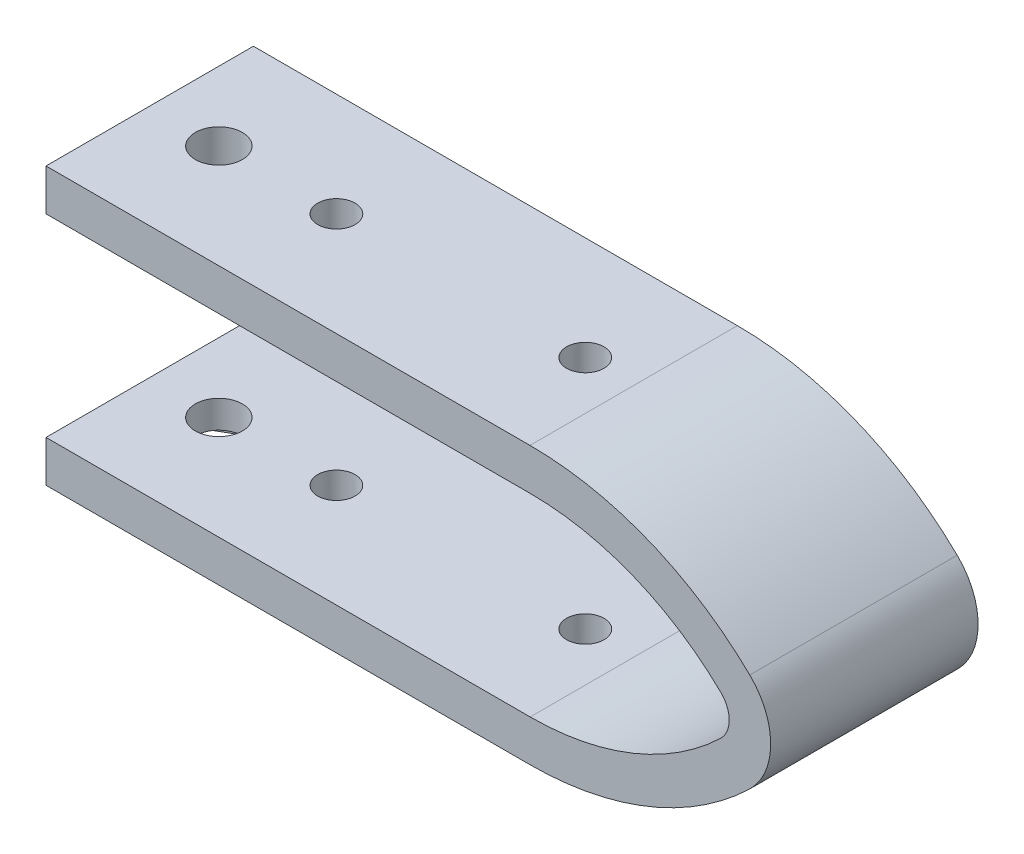
ISO-10303-21;
HEADER;
FILE_DESCRIPTION(('STEP AP214'),'2;1');
FILE_NAME('part.step','',(''),(''),'','','');
FILE_SCHEMA(('AUTOMOTIVE_DESIGN { 1 0 10303 214 1 1 1 1 }'));
ENDSEC;
DATA;
#1=APPLICATION_CONTEXT('core data for automotive mechanical design processes');
#2=APPLICATION_PROTOCOL_DEFINITION('international standard','automotive_design',2000,#1);
#3=PRODUCT_CONTEXT('',#1,'mechanical');
#4=PRODUCT('Part','Part','',(#3));
#5=PRODUCT_RELATED_PRODUCT_CATEGORY('part','',(#4));
#6=PRODUCT_DEFINITION_FORMATION('','',#4);
#7=PRODUCT_DEFINITION_CONTEXT('part definition',#1,'design');
#8=PRODUCT_DEFINITION('design','',#6,#7);
#9=PRODUCT_DEFINITION_SHAPE('','',#8);
#10=(LENGTH_UNIT() NAMED_UNIT(*) SI_UNIT(.MILLI.,.METRE.));
#11=(NAMED_UNIT(*) PLANE_ANGLE_UNIT() SI_UNIT($,.RADIAN.));
#12=(NAMED_UNIT(*) SI_UNIT($,.STERADIAN.) SOLID_ANGLE_UNIT());
#13=UNCERTAINTY_MEASURE_WITH_UNIT(LENGTH_MEASURE(1.E-05),#10,'distance_accuracy_value','');
#14=(GEOMETRIC_REPRESENTATION_CONTEXT(3) GLOBAL_UNCERTAINTY_ASSIGNED_CONTEXT((#13)) GLOBAL_UNIT_ASSIGNED_CONTEXT((#10,
#11,#12)) REPRESENTATION_CONTEXT('',''));
#15=CARTESIAN_POINT('',(0.,0.,0.));
#16=DIRECTION('',(0.,0.,1.));
#17=DIRECTION('',(1.,0.,0.));
#18=AXIS2_PLACEMENT_3D('',#15,#16,#17);
#19=CARTESIAN_POINT('',(5.,0.,7.5));
#20=DIRECTION('',(0.,1.,0.));
#21=DIRECTION('',(0.,0.,1.));
#22=AXIS2_PLACEMENT_3D('',#19,#20,#21);
#23=CYLINDRICAL_SURFACE('',#22,1.7);
#24=CARTESIAN_POINT('',(5.,3.,7.5));
#25=DIRECTION('',(0.,-1.,0.));
#26=DIRECTION('',(0.,0.,-1.));
#27=AXIS2_PLACEMENT_3D('',#24,#25,#26);
#28=CIRCLE('',#27,1.7);
#29=CARTESIAN_POINT('',(5.,3.,5.8));
#30=VERTEX_POINT('',#29);
#31=EDGE_CURVE('E214',#30,#30,#28,.T.);
#32=ORIENTED_EDGE('',*,*,#31,.F.);
#33=EDGE_LOOP('',(#32));
#34=FACE_BOUND('',#33,.T.);
#35=CARTESIAN_POINT('',(5.,1.,7.5));
#36=DIRECTION('',(0.,-1.,0.));
#37=DIRECTION('',(0.,0.,-1.));
#38=AXIS2_PLACEMENT_3D('',#35,#36,#37);
#39=CIRCLE('',#38,1.7);
#40=CARTESIAN_POINT('',(5.,1.,5.8));
#41=VERTEX_POINT('',#40);
#42=EDGE_CURVE('E35',#41,#41,#39,.F.);
#43=ORIENTED_EDGE('',*,*,#42,.F.);
#44=EDGE_LOOP('',(#43));
#45=FACE_BOUND('',#44,.T.);
#46=ADVANCED_FACE('F31',(#34,#45),#23,.F.);
#47=CARTESIAN_POINT('',(0.,0.,15.));
#48=DIRECTION('',(1.,0.,0.));
#49=DIRECTION('',(0.,0.,-1.));
#50=AXIS2_PLACEMENT_3D('',#47,#48,#49);
#51=PLANE('',#50);
#52=DIRECTION('',(0.,-1.,0.));
#53=VECTOR('',#52,1.);
#54=CARTESIAN_POINT('',(0.,0.,0.));
#55=LINE('',#54,#53);
#56=CARTESIAN_POINT('',(0.,3.,0.));
#57=VERTEX_POINT('',#56);
#58=CARTESIAN_POINT('',(0.,0.,0.));
#59=VERTEX_POINT('',#58);
#60=EDGE_CURVE('E166',#57,#59,#55,.T.);
#61=ORIENTED_EDGE('',*,*,#60,.T.);
#62=DIRECTION('',(0.,0.,-1.));
#63=VECTOR('',#62,1.);
#64=CARTESIAN_POINT('',(0.,0.,15.));
#65=LINE('',#64,#63);
#66=CARTESIAN_POINT('',(0.,0.,15.));
#67=VERTEX_POINT('',#66);
#68=EDGE_CURVE('E11',#67,#59,#65,.T.);
#69=ORIENTED_EDGE('',*,*,#68,.F.);
#70=DIRECTION('',(0.,-1.,0.));
#71=VECTOR('',#70,1.);
#72=CARTESIAN_POINT('',(0.,0.,15.));
#73=LINE('',#72,#71);
#74=CARTESIAN_POINT('',(0.,3.,15.));
#75=VERTEX_POINT('',#74);
#76=EDGE_CURVE('E190',#75,#67,#73,.T.);
#77=ORIENTED_EDGE('',*,*,#76,.F.);
#78=DIRECTION('',(0.,0.,-1.));
#79=VECTOR('',#78,1.);
#80=CARTESIAN_POINT('',(0.,3.,15.));
#81=LINE('',#80,#79);
#82=EDGE_CURVE('E162',#75,#57,#81,.T.);
#83=ORIENTED_EDGE('',*,*,#82,.T.);
#84=EDGE_LOOP('',(#61,#69,#77,#83));
#85=FACE_BOUND('',#84,.T.);
#86=ADVANCED_FACE('F33',(#85),#51,.F.);
#87=CARTESIAN_POINT('',(0.,0.,15.));
#88=DIRECTION('',(0.,1.,0.));
#89=DIRECTION('',(0.,0.,1.));
#90=AXIS2_PLACEMENT_3D('',#87,#88,#89);
#91=PLANE('',#90);
#92=DIRECTION('',(-0.866025403784439,0.,-0.5));
#93=VECTOR('',#92,1.);
#94=CARTESIAN_POINT('',(5.,0.,10.8486315612998));
#95=LINE('',#94,#93);
#96=CARTESIAN_POINT('',(5.,0.,10.8486315612998));
#97=VERTEX_POINT('',#96);
#98=CARTESIAN_POINT('',(2.1,0.,9.17431578064991));
#99=VERTEX_POINT('',#98);
#100=EDGE_CURVE('E564',#97,#99,#95,.T.);
#101=ORIENTED_EDGE('',*,*,#100,.F.);
#102=DIRECTION('',(-0.866025403784439,0.,0.499999999999999));
#103=VECTOR('',#102,1.);
#104=CARTESIAN_POINT('',(7.9,0.,9.17431578064992));
#105=LINE('',#104,#103);
#106=CARTESIAN_POINT('',(7.9,0.,9.17431578064992));
#107=VERTEX_POINT('',#106);
#108=EDGE_CURVE('E48',#107,#97,#105,.T.);
#109=ORIENTED_EDGE('',*,*,#108,.F.);
#110=DIRECTION('',(0.,0.,1.));
#111=VECTOR('',#110,1.);
#112=CARTESIAN_POINT('',(7.9,0.,5.82568421935008));
#113=LINE('',#112,#111);
#114=CARTESIAN_POINT('',(7.9,0.,5.82568421935008));
#115=VERTEX_POINT('',#114);
#116=EDGE_CURVE('E588',#115,#107,#113,.T.);
#117=ORIENTED_EDGE('',*,*,#116,.F.);
#118=DIRECTION('',(0.866025403784438,0.,0.5));
#119=VECTOR('',#118,1.);
#120=CARTESIAN_POINT('',(5.,0.,4.15136843870017));
#121=LINE('',#120,#119);
#122=CARTESIAN_POINT('',(5.,0.,4.15136843870017));
#123=VERTEX_POINT('',#122);
#124=EDGE_CURVE('E582',#123,#115,#121,.T.);
#125=ORIENTED_EDGE('',*,*,#124,.F.);
#126=DIRECTION('',(0.866025403784439,0.,-0.499999999999999));
#127=VECTOR('',#126,1.);
#128=CARTESIAN_POINT('',(2.1,0.,5.82568421935008));
#129=LINE('',#128,#127);
#130=CARTESIAN_POINT('',(2.1,0.,5.82568421935008));
#131=VERTEX_POINT('',#130);
#132=EDGE_CURVE('E579',#131,#123,#129,.T.);
#133=ORIENTED_EDGE('',*,*,#132,.F.);
#134=DIRECTION('',(0.,0.,-1.));
#135=VECTOR('',#134,1.);
#136=CARTESIAN_POINT('',(2.1,0.,9.17431578064991));
#137=LINE('',#136,#135);
#138=EDGE_CURVE('E573',#99,#131,#137,.T.);
#139=ORIENTED_EDGE('',*,*,#138,.F.);
#140=EDGE_LOOP('',(#101,#109,#117,#125,#133,#139));
#141=FACE_BOUND('',#140,.T.);
#142=CARTESIAN_POINT('',(31.5,0.,7.5));
#143=DIRECTION('',(0.,1.,0.));
#144=DIRECTION('',(0.,0.,1.));
#145=AXIS2_PLACEMENT_3D('',#142,#143,#144);
#146=CIRCLE('',#145,1.35);
#147=CARTESIAN_POINT('',(31.5,0.,8.85));
#148=VERTEX_POINT('',#147);
#149=EDGE_CURVE('E225',#148,#148,#146,.T.);
#150=ORIENTED_EDGE('',*,*,#149,.T.);
#151=EDGE_LOOP('',(#150));
#152=FACE_BOUND('',#151,.T.);
#153=CARTESIAN_POINT('',(13.5,0.,7.5));
#154=DIRECTION('',(0.,1.,0.));
#155=DIRECTION('',(0.,0.,1.));
#156=AXIS2_PLACEMENT_3D('',#153,#154,#155);
#157=CIRCLE('',#156,1.35);
#158=CARTESIAN_POINT('',(13.5,0.,8.85));
#159=VERTEX_POINT('',#158);
#160=EDGE_CURVE('E221',#159,#159,#157,.T.);
#161=ORIENTED_EDGE('',*,*,#160,.T.);
#162=EDGE_LOOP('',(#161));
#163=FACE_BOUND('',#162,.T.);
#164=DIRECTION('',(1.,0.,0.));
#165=VECTOR('',#164,1.);
#166=CARTESIAN_POINT('',(0.,0.,0.));
#167=LINE('',#166,#165);
#168=CARTESIAN_POINT('',(35.,0.,0.));
#169=VERTEX_POINT('',#168);
#170=EDGE_CURVE('E169',#59,#169,#167,.T.);
#171=ORIENTED_EDGE('',*,*,#170,.T.);
#172=DIRECTION('',(0.,0.,-1.));
#173=VECTOR('',#172,1.);
#174=CARTESIAN_POINT('',(35.,0.,15.));
#175=LINE('',#174,#173);
#176=CARTESIAN_POINT('',(35.,0.,15.));
#177=VERTEX_POINT('',#176);
#178=EDGE_CURVE('E40',#177,#169,#175,.T.);
#179=ORIENTED_EDGE('',*,*,#178,.F.);
#180=DIRECTION('',(1.,0.,0.));
#181=VECTOR('',#180,1.);
#182=CARTESIAN_POINT('',(0.,0.,15.));
#183=LINE('',#182,#181);
#184=EDGE_CURVE('E110',#67,#177,#183,.T.);
#185=ORIENTED_EDGE('',*,*,#184,.F.);
#186=ORIENTED_EDGE('',*,*,#68,.T.);
#187=EDGE_LOOP('',(#171,#179,#185,#186));
#188=FACE_BOUND('',#187,.T.);
#189=ADVANCED_FACE('F284',(#141,#152,#163,#188),#91,.F.);
#190=CARTESIAN_POINT('',(35.,22.8611120698616,15.));
#191=DIRECTION('',(0.,0.,-1.));
#192=DIRECTION('',(-1.,0.,0.));
#193=AXIS2_PLACEMENT_3D('',#190,#191,#192);
#194=CYLINDRICAL_SURFACE('',#193,22.8611120698616);
#195=CARTESIAN_POINT('',(35.,22.8611120698616,0.));
#196=DIRECTION('',(0.,0.,1.));
#197=DIRECTION('',(1.,0.,0.));
#198=AXIS2_PLACEMENT_3D('',#195,#196,#197);
#199=CIRCLE('',#198,22.8611120698616);
#200=CARTESIAN_POINT('',(50.8963063835796,6.43132544829715,0.));
#201=VERTEX_POINT('',#200);
#202=EDGE_CURVE('E172',#169,#201,#199,.T.);
#203=ORIENTED_EDGE('',*,*,#202,.T.);
#204=DIRECTION('',(0.,0.,-1.));
#205=VECTOR('',#204,1.);
#206=CARTESIAN_POINT('',(50.8963063835796,6.43132544829715,15.));
#207=LINE('',#206,#205);
#208=CARTESIAN_POINT('',(50.8963063835796,6.43132544829715,15.));
#209=VERTEX_POINT('',#208);
#210=EDGE_CURVE('E209',#209,#201,#207,.T.);
#211=ORIENTED_EDGE('',*,*,#210,.F.);
#212=CARTESIAN_POINT('',(35.,22.8611120698616,15.));
#213=DIRECTION('',(0.,0.,1.));
#214=DIRECTION('',(1.,0.,0.));
#215=AXIS2_PLACEMENT_3D('',#212,#213,#214);
#216=CIRCLE('',#215,22.8611120698616);
#217=EDGE_CURVE('E254',#177,#209,#216,.T.);
#218=ORIENTED_EDGE('',*,*,#217,.F.);
#219=ORIENTED_EDGE('',*,*,#178,.T.);
#220=EDGE_LOOP('',(#203,#211,#218,#219));
#221=FACE_BOUND('',#220,.T.);
#222=ADVANCED_FACE('F287',(#221),#194,.T.);
#223=CARTESIAN_POINT('',(47.4435077950274,10.,15.));
#224=DIRECTION('',(0.,0.,-1.));
#225=DIRECTION('',(-1.,0.,0.));
#226=AXIS2_PLACEMENT_3D('',#223,#224,#225);
#227=CYLINDRICAL_SURFACE('',#226,4.96560732932838);
#228=CARTESIAN_POINT('',(47.4435077950274,10.,0.));
#229=DIRECTION('',(0.,0.,1.));
#230=DIRECTION('',(1.,0.,0.));
#231=AXIS2_PLACEMENT_3D('',#228,#229,#230);
#232=CIRCLE('',#231,4.96560732932838);
#233=CARTESIAN_POINT('',(50.8963063835796,13.5686745517028,0.));
#234=VERTEX_POINT('',#233);
#235=EDGE_CURVE('E174',#201,#234,#232,.T.);
#236=ORIENTED_EDGE('',*,*,#235,.T.);
#237=DIRECTION('',(0.,0.,-1.));
#238=VECTOR('',#237,1.);
#239=CARTESIAN_POINT('',(50.8963063835796,13.5686745517028,15.));
#240=LINE('',#239,#238);
#241=CARTESIAN_POINT('',(50.8963063835796,13.5686745517028,15.));
#242=VERTEX_POINT('',#241);
#243=EDGE_CURVE('E206',#242,#234,#240,.T.);
#244=ORIENTED_EDGE('',*,*,#243,.F.);
#245=CARTESIAN_POINT('',(47.4435077950274,10.,15.));
#246=DIRECTION('',(0.,0.,1.));
#247=DIRECTION('',(1.,0.,0.));
#248=AXIS2_PLACEMENT_3D('',#245,#246,#247);
#249=CIRCLE('',#248,4.96560732932838);
#250=EDGE_CURVE('E256',#209,#242,#249,.T.);
#251=ORIENTED_EDGE('',*,*,#250,.F.);
#252=ORIENTED_EDGE('',*,*,#210,.T.);
#253=EDGE_LOOP('',(#236,#244,#251,#252));
#254=FACE_BOUND('',#253,.T.);
#255=ADVANCED_FACE('F292',(#254),#227,.T.);
#256=CARTESIAN_POINT('',(35.,-2.86111206986165,15.));
#257=DIRECTION('',(0.,0.,-1.));
#258=DIRECTION('',(-1.,0.,0.));
#259=AXIS2_PLACEMENT_3D('',#256,#257,#258);
#260=CYLINDRICAL_SURFACE('',#259,22.8611120698616);
#261=CARTESIAN_POINT('',(35.,-2.86111206986165,0.));
#262=DIRECTION('',(0.,0.,1.));
#263=DIRECTION('',(-1.,0.,0.));
#264=AXIS2_PLACEMENT_3D('',#261,#262,#263);
#265=CIRCLE('',#264,22.8611120698616);
#266=CARTESIAN_POINT('',(35.,20.,0.));
#267=VERTEX_POINT('',#266);
#268=EDGE_CURVE('E176',#234,#267,#265,.T.);
#269=ORIENTED_EDGE('',*,*,#268,.T.);
#270=DIRECTION('',(0.,0.,-1.));
#271=VECTOR('',#270,1.);
#272=CARTESIAN_POINT('',(35.,20.,15.));
#273=LINE('',#272,#271);
#274=CARTESIAN_POINT('',(35.,20.,15.));
#275=VERTEX_POINT('',#274);
#276=EDGE_CURVE('E203',#275,#267,#273,.T.);
#277=ORIENTED_EDGE('',*,*,#276,.F.);
#278=CARTESIAN_POINT('',(35.,-2.86111206986165,15.));
#279=DIRECTION('',(0.,0.,1.));
#280=DIRECTION('',(-1.,0.,0.));
#281=AXIS2_PLACEMENT_3D('',#278,#279,#280);
#282=CIRCLE('',#281,22.8611120698616);
#283=EDGE_CURVE('E258',#242,#275,#282,.T.);
#284=ORIENTED_EDGE('',*,*,#283,.F.);
#285=ORIENTED_EDGE('',*,*,#243,.T.);
#286=EDGE_LOOP('',(#269,#277,#284,#285));
#287=FACE_BOUND('',#286,.T.);
#288=ADVANCED_FACE('F298',(#287),#260,.T.);
#289=CARTESIAN_POINT('',(0.,20.,15.));
#290=DIRECTION('',(0.,-1.,0.));
#291=DIRECTION('',(0.,0.,-1.));
#292=AXIS2_PLACEMENT_3D('',#289,#290,#291);
#293=PLANE('',#292);
#294=CARTESIAN_POINT('',(31.5,20.,7.5));
#295=DIRECTION('',(0.,1.,0.));
#296=DIRECTION('',(0.,0.,1.));
#297=AXIS2_PLACEMENT_3D('',#294,#295,#296);
#298=CIRCLE('',#297,1.35);
#299=CARTESIAN_POINT('',(31.5,20.,8.85));
#300=VERTEX_POINT('',#299);
#301=EDGE_CURVE('E232',#300,#300,#298,.T.);
#302=ORIENTED_EDGE('',*,*,#301,.F.);
#303=EDGE_LOOP('',(#302));
#304=FACE_BOUND('',#303,.T.);
#305=CARTESIAN_POINT('',(13.5,20.,7.5));
#306=DIRECTION('',(0.,1.,0.));
#307=DIRECTION('',(0.,0.,1.));
#308=AXIS2_PLACEMENT_3D('',#305,#306,#307);
#309=CIRCLE('',#308,1.35);
#310=CARTESIAN_POINT('',(13.5,20.,8.85));
#311=VERTEX_POINT('',#310);
#312=EDGE_CURVE('E229',#311,#311,#309,.T.);
#313=ORIENTED_EDGE('',*,*,#312,.F.);
#314=EDGE_LOOP('',(#313));
#315=FACE_BOUND('',#314,.T.);
#316=CARTESIAN_POINT('',(5.,20.,7.5));
#317=DIRECTION('',(0.,1.,0.));
#318=DIRECTION('',(0.,0.,1.));
#319=AXIS2_PLACEMENT_3D('',#316,#317,#318);
#320=CIRCLE('',#319,1.7);
#321=CARTESIAN_POINT('',(5.,20.,9.2));
#322=VERTEX_POINT('',#321);
#323=EDGE_CURVE('E217',#322,#322,#320,.T.);
#324=ORIENTED_EDGE('',*,*,#323,.F.);
#325=EDGE_LOOP('',(#324));
#326=FACE_BOUND('',#325,.T.);
#327=DIRECTION('',(-1.,0.,0.));
#328=VECTOR('',#327,1.);
#329=CARTESIAN_POINT('',(0.,20.,0.));
#330=LINE('',#329,#328);
#331=CARTESIAN_POINT('',(0.,20.,0.));
#332=VERTEX_POINT('',#331);
#333=EDGE_CURVE('E178',#267,#332,#330,.T.);
#334=ORIENTED_EDGE('',*,*,#333,.T.);
#335=DIRECTION('',(0.,0.,-1.));
#336=VECTOR('',#335,1.);
#337=CARTESIAN_POINT('',(0.,20.,15.));
#338=LINE('',#337,#336);
#339=CARTESIAN_POINT('',(0.,20.,15.));
#340=VERTEX_POINT('',#339);
#341=EDGE_CURVE('E200',#340,#332,#338,.T.);
#342=ORIENTED_EDGE('',*,*,#341,.F.);
#343=DIRECTION('',(-1.,0.,0.));
#344=VECTOR('',#343,1.);
#345=CARTESIAN_POINT('',(0.,20.,15.));
#346=LINE('',#345,#344);
#347=EDGE_CURVE('E260',#275,#340,#346,.T.);
#348=ORIENTED_EDGE('',*,*,#347,.F.);
#349=ORIENTED_EDGE('',*,*,#276,.T.);
#350=EDGE_LOOP('',(#334,#342,#348,#349));
#351=FACE_BOUND('',#350,.T.);
#352=ADVANCED_FACE('F302',(#304,#315,#326,#351),#293,.F.);
#353=CARTESIAN_POINT('',(0.,20.,15.));
#354=DIRECTION('',(1.,0.,0.));
#355=DIRECTION('',(0.,0.,-1.));
#356=AXIS2_PLACEMENT_3D('',#353,#354,#355);
#357=PLANE('',#356);
#358=DIRECTION('',(0.,-1.,0.));
#359=VECTOR('',#358,1.);
#360=CARTESIAN_POINT('',(0.,20.,0.));
#361=LINE('',#360,#359);
#362=CARTESIAN_POINT('',(0.,17.,0.));
#363=VERTEX_POINT('',#362);
#364=EDGE_CURVE('E180',#332,#363,#361,.T.);
#365=ORIENTED_EDGE('',*,*,#364,.T.);
#366=DIRECTION('',(0.,0.,-1.));
#367=VECTOR('',#366,1.);
#368=CARTESIAN_POINT('',(0.,17.,15.));
#369=LINE('',#368,#367);
#370=CARTESIAN_POINT('',(0.,17.,15.));
#371=VERTEX_POINT('',#370);
#372=EDGE_CURVE('E197',#371,#363,#369,.T.);
#373=ORIENTED_EDGE('',*,*,#372,.F.);
#374=DIRECTION('',(0.,-1.,0.));
#375=VECTOR('',#374,1.);
#376=CARTESIAN_POINT('',(0.,20.,15.));
#377=LINE('',#376,#375);
#378=EDGE_CURVE('E262',#340,#371,#377,.T.);
#379=ORIENTED_EDGE('',*,*,#378,.F.);
#380=ORIENTED_EDGE('',*,*,#341,.T.);
#381=EDGE_LOOP('',(#365,#373,#379,#380));
#382=FACE_BOUND('',#381,.T.);
#383=ADVANCED_FACE('F305',(#382),#357,.F.);
#384=CARTESIAN_POINT('',(0.,17.,15.));
#385=DIRECTION('',(0.,1.,0.));
#386=DIRECTION('',(0.,0.,1.));
#387=AXIS2_PLACEMENT_3D('',#384,#385,#386);
#388=PLANE('',#387);
#389=CARTESIAN_POINT('',(31.5,17.,7.5));
#390=DIRECTION('',(0.,1.,0.));
#391=DIRECTION('',(0.,0.,1.));
#392=AXIS2_PLACEMENT_3D('',#389,#390,#391);
#393=CIRCLE('',#392,1.35);
#394=CARTESIAN_POINT('',(31.5,17.,8.85));
#395=VERTEX_POINT('',#394);
#396=EDGE_CURVE('E224',#395,#395,#393,.T.);
#397=ORIENTED_EDGE('',*,*,#396,.T.);
#398=EDGE_LOOP('',(#397));
#399=FACE_BOUND('',#398,.T.);
#400=CARTESIAN_POINT('',(13.5,17.,7.5));
#401=DIRECTION('',(0.,1.,0.));
#402=DIRECTION('',(0.,0.,1.));
#403=AXIS2_PLACEMENT_3D('',#400,#401,#402);
#404=CIRCLE('',#403,1.35);
#405=CARTESIAN_POINT('',(13.5,17.,8.85));
#406=VERTEX_POINT('',#405);
#407=EDGE_CURVE('E220',#406,#406,#404,.T.);
#408=ORIENTED_EDGE('',*,*,#407,.T.);
#409=EDGE_LOOP('',(#408));
#410=FACE_BOUND('',#409,.T.);
#411=CARTESIAN_POINT('',(5.,17.,7.5));
#412=DIRECTION('',(0.,1.,0.));
#413=DIRECTION('',(0.,0.,1.));
#414=AXIS2_PLACEMENT_3D('',#411,#412,#413);
#415=CIRCLE('',#414,1.7);
#416=CARTESIAN_POINT('',(5.,17.,9.2));
#417=VERTEX_POINT('',#416);
#418=EDGE_CURVE('E170',#417,#417,#415,.T.);
#419=ORIENTED_EDGE('',*,*,#418,.T.);
#420=EDGE_LOOP('',(#419));
#421=FACE_BOUND('',#420,.T.);
#422=DIRECTION('',(1.,0.,0.));
#423=VECTOR('',#422,1.);
#424=CARTESIAN_POINT('',(0.,17.,0.));
#425=LINE('',#424,#423);
#426=CARTESIAN_POINT('',(35.0151197758567,17.,0.));
#427=VERTEX_POINT('',#426);
#428=EDGE_CURVE('E182',#363,#427,#425,.T.);
#429=ORIENTED_EDGE('',*,*,#428,.T.);
#430=DIRECTION('',(0.,0.,-1.));
#431=VECTOR('',#430,1.);
#432=CARTESIAN_POINT('',(35.0151197758567,17.,15.));
#433=LINE('',#432,#431);
#434=CARTESIAN_POINT('',(35.0151197758567,17.,15.));
#435=VERTEX_POINT('',#434);
#436=EDGE_CURVE('E194',#435,#427,#433,.T.);
#437=ORIENTED_EDGE('',*,*,#436,.F.);
#438=DIRECTION('',(1.,0.,0.));
#439=VECTOR('',#438,1.);
#440=CARTESIAN_POINT('',(0.,17.,15.));
#441=LINE('',#440,#439);
#442=EDGE_CURVE('E264',#371,#435,#441,.T.);
#443=ORIENTED_EDGE('',*,*,#442,.F.);
#444=ORIENTED_EDGE('',*,*,#372,.T.);
#445=EDGE_LOOP('',(#429,#437,#443,#444));
#446=FACE_BOUND('',#445,.T.);
#447=ADVANCED_FACE('F270',(#399,#410,#421,#446),#388,.F.);
#448=CARTESIAN_POINT('',(35.0151197758567,-2.86111206986165,15.));
#449=DIRECTION('',(0.,0.,-1.));
#450=DIRECTION('',(-1.,0.,0.));
#451=AXIS2_PLACEMENT_3D('',#448,#449,#450);
#452=CYLINDRICAL_SURFACE('',#451,19.8611120698617);
#453=CARTESIAN_POINT('',(35.0151197758567,-2.86111206986165,0.));
#454=DIRECTION('',(0.,0.,-1.));
#455=DIRECTION('',(-1.,0.,0.));
#456=AXIS2_PLACEMENT_3D('',#453,#454,#455);
#457=CIRCLE('',#456,19.8611120698617);
#458=CARTESIAN_POINT('',(48.7969341246534,11.4401244468493,0.));
#459=VERTEX_POINT('',#458);
#460=EDGE_CURVE('E184',#427,#459,#457,.T.);
#461=ORIENTED_EDGE('',*,*,#460,.T.);
#462=DIRECTION('',(0.,0.,-1.));
#463=VECTOR('',#462,1.);
#464=CARTESIAN_POINT('',(48.7969341246534,11.4401244468493,15.));
#465=LINE('',#464,#463);
#466=CARTESIAN_POINT('',(48.7969341246534,11.4401244468493,15.));
#467=VERTEX_POINT('',#466);
#468=EDGE_CURVE('E157',#467,#459,#465,.T.);
#469=ORIENTED_EDGE('',*,*,#468,.F.);
#470=CARTESIAN_POINT('',(35.0151197758567,-2.86111206986165,15.));
#471=DIRECTION('',(0.,0.,-1.));
#472=DIRECTION('',(-1.,0.,0.));
#473=AXIS2_PLACEMENT_3D('',#470,#471,#472);
#474=CIRCLE('',#473,19.8611120698617);
#475=EDGE_CURVE('E145',#435,#467,#474,.T.);
#476=ORIENTED_EDGE('',*,*,#475,.F.);
#477=ORIENTED_EDGE('',*,*,#436,.T.);
#478=EDGE_LOOP('',(#461,#469,#476,#477));
#479=FACE_BOUND('',#478,.T.);
#480=ADVANCED_FACE('F274',(#479),#452,.F.);
#481=CARTESIAN_POINT('',(47.4091151243558,10.,15.));
#482=DIRECTION('',(0.,0.,-1.));
#483=DIRECTION('',(-1.,0.,0.));
#484=AXIS2_PLACEMENT_3D('',#481,#482,#483);
#485=CYLINDRICAL_SURFACE('',#484,2.00000000000001);
#486=CARTESIAN_POINT('',(47.4091151243558,10.,0.));
#487=DIRECTION('',(0.,0.,-1.));
#488=DIRECTION('',(-1.,0.,0.));
#489=AXIS2_PLACEMENT_3D('',#486,#487,#488);
#490=CIRCLE('',#489,2.00000000000001);
#491=CARTESIAN_POINT('',(48.7969341246534,8.55987555315067,0.));
#492=VERTEX_POINT('',#491);
#493=EDGE_CURVE('E154',#459,#492,#490,.T.);
#494=ORIENTED_EDGE('',*,*,#493,.T.);
#495=DIRECTION('',(0.,0.,-1.));
#496=VECTOR('',#495,1.);
#497=CARTESIAN_POINT('',(48.7969341246534,8.55987555315067,15.));
#498=LINE('',#497,#496);
#499=CARTESIAN_POINT('',(48.7969341246534,8.55987555315067,15.));
#500=VERTEX_POINT('',#499);
#501=EDGE_CURVE('E151',#500,#492,#498,.T.);
#502=ORIENTED_EDGE('',*,*,#501,.F.);
#503=CARTESIAN_POINT('',(47.4091151243558,10.,15.));
#504=DIRECTION('',(0.,0.,-1.));
#505=DIRECTION('',(-1.,0.,0.));
#506=AXIS2_PLACEMENT_3D('',#503,#504,#505);
#507=CIRCLE('',#506,2.00000000000001);
#508=EDGE_CURVE('E138',#467,#500,#507,.T.);
#509=ORIENTED_EDGE('',*,*,#508,.F.);
#510=ORIENTED_EDGE('',*,*,#468,.T.);
#511=EDGE_LOOP('',(#494,#502,#509,#510));
#512=FACE_BOUND('',#511,.T.);
#513=ADVANCED_FACE('F152',(#512),#485,.F.);
#514=CARTESIAN_POINT('',(35.0151197758567,22.8611120698616,15.));
#515=DIRECTION('',(0.,0.,-1.));
#516=DIRECTION('',(-1.,0.,0.));
#517=AXIS2_PLACEMENT_3D('',#514,#515,#516);
#518=CYLINDRICAL_SURFACE('',#517,19.8611120698617);
#519=CARTESIAN_POINT('',(35.0151197758567,22.8611120698616,0.));
#520=DIRECTION('',(0.,0.,-1.));
#521=DIRECTION('',(1.,0.,0.));
#522=AXIS2_PLACEMENT_3D('',#519,#520,#521);
#523=CIRCLE('',#522,19.8611120698617);
#524=CARTESIAN_POINT('',(35.0151197758567,3.,0.));
#525=VERTEX_POINT('',#524);
#526=EDGE_CURVE('E187',#492,#525,#523,.T.);
#527=ORIENTED_EDGE('',*,*,#526,.T.);
#528=DIRECTION('',(0.,0.,-1.));
#529=VECTOR('',#528,1.);
#530=CARTESIAN_POINT('',(35.0151197758567,3.,15.));
#531=LINE('',#530,#529);
#532=CARTESIAN_POINT('',(35.0151197758567,3.,15.));
#533=VERTEX_POINT('',#532);
#534=EDGE_CURVE('E158',#533,#525,#531,.T.);
#535=ORIENTED_EDGE('',*,*,#534,.F.);
#536=CARTESIAN_POINT('',(35.0151197758567,22.8611120698616,15.));
#537=DIRECTION('',(0.,0.,-1.));
#538=DIRECTION('',(1.,0.,0.));
#539=AXIS2_PLACEMENT_3D('',#536,#537,#538);
#540=CIRCLE('',#539,19.8611120698617);
#541=EDGE_CURVE('E142',#500,#533,#540,.T.);
#542=ORIENTED_EDGE('',*,*,#541,.F.);
#543=ORIENTED_EDGE('',*,*,#501,.T.);
#544=EDGE_LOOP('',(#527,#535,#542,#543));
#545=FACE_BOUND('',#544,.T.);
#546=ADVANCED_FACE('F160',(#545),#518,.F.);
#547=CARTESIAN_POINT('',(0.,3.,15.));
#548=DIRECTION('',(0.,-1.,0.));
#549=DIRECTION('',(0.,0.,-1.));
#550=AXIS2_PLACEMENT_3D('',#547,#548,#549);
#551=PLANE('',#550);
#552=CARTESIAN_POINT('',(31.5,3.,7.5));
#553=DIRECTION('',(0.,-1.,0.));
#554=DIRECTION('',(0.,0.,-1.));
#555=AXIS2_PLACEMENT_3D('',#552,#553,#554);
#556=CIRCLE('',#555,1.35);
#557=CARTESIAN_POINT('',(31.5,3.,6.15));
#558=VERTEX_POINT('',#557);
#559=EDGE_CURVE('E222',#558,#558,#556,.T.);
#560=ORIENTED_EDGE('',*,*,#559,.T.);
#561=EDGE_LOOP('',(#560));
#562=FACE_BOUND('',#561,.T.);
#563=CARTESIAN_POINT('',(13.5,3.,7.5));
#564=DIRECTION('',(0.,-1.,0.));
#565=DIRECTION('',(0.,0.,-1.));
#566=AXIS2_PLACEMENT_3D('',#563,#564,#565);
#567=CIRCLE('',#566,1.35);
#568=CARTESIAN_POINT('',(13.5,3.,6.15));
#569=VERTEX_POINT('',#568);
#570=EDGE_CURVE('E218',#569,#569,#567,.T.);
#571=ORIENTED_EDGE('',*,*,#570,.T.);
#572=EDGE_LOOP('',(#571));
#573=FACE_BOUND('',#572,.T.);
#574=ORIENTED_EDGE('',*,*,#31,.T.);
#575=EDGE_LOOP('',(#574));
#576=FACE_BOUND('',#575,.T.);
#577=DIRECTION('',(-1.,0.,0.));
#578=VECTOR('',#577,1.);
#579=CARTESIAN_POINT('',(0.,3.,0.));
#580=LINE('',#579,#578);
#581=EDGE_CURVE('E102',#525,#57,#580,.T.);
#582=ORIENTED_EDGE('',*,*,#581,.T.);
#583=ORIENTED_EDGE('',*,*,#82,.F.);
#584=DIRECTION('',(-1.,0.,0.));
#585=VECTOR('',#584,1.);
#586=CARTESIAN_POINT('',(0.,3.,15.));
#587=LINE('',#586,#585);
#588=EDGE_CURVE('E57',#533,#75,#587,.T.);
#589=ORIENTED_EDGE('',*,*,#588,.F.);
#590=ORIENTED_EDGE('',*,*,#534,.T.);
#591=EDGE_LOOP('',(#582,#583,#589,#590));
#592=FACE_BOUND('',#591,.T.);
#593=ADVANCED_FACE('F278',(#562,#573,#576,#592),#551,.F.);
#594=CARTESIAN_POINT('',(35.0151197758567,22.8611120698616,15.));
#595=DIRECTION('',(0.,0.,1.));
#596=DIRECTION('',(1.,0.,0.));
#597=AXIS2_PLACEMENT_3D('',#594,#595,#596);
#598=PLANE('',#597);
#599=ORIENTED_EDGE('',*,*,#76,.T.);
#600=ORIENTED_EDGE('',*,*,#184,.T.);
#601=ORIENTED_EDGE('',*,*,#217,.T.);
#602=ORIENTED_EDGE('',*,*,#250,.T.);
#603=ORIENTED_EDGE('',*,*,#283,.T.);
#604=ORIENTED_EDGE('',*,*,#347,.T.);
#605=ORIENTED_EDGE('',*,*,#378,.T.);
#606=ORIENTED_EDGE('',*,*,#442,.T.);
#607=ORIENTED_EDGE('',*,*,#475,.T.);
#608=ORIENTED_EDGE('',*,*,#508,.T.);
#609=ORIENTED_EDGE('',*,*,#541,.T.);
#610=ORIENTED_EDGE('',*,*,#588,.T.);
#611=EDGE_LOOP('',(#599,#600,#601,#602,#603,#604,#605,#606,#607,#608,#609,#610));
#612=FACE_BOUND('',#611,.T.);
#613=ADVANCED_FACE('F140',(#612),#598,.T.);
#614=CARTESIAN_POINT('',(35.0151197758567,22.8611120698616,0.));
#615=DIRECTION('',(0.,0.,1.));
#616=DIRECTION('',(1.,0.,0.));
#617=AXIS2_PLACEMENT_3D('',#614,#615,#616);
#618=PLANE('',#617);
#619=ORIENTED_EDGE('',*,*,#60,.F.);
#620=ORIENTED_EDGE('',*,*,#581,.F.);
#621=ORIENTED_EDGE('',*,*,#526,.F.);
#622=ORIENTED_EDGE('',*,*,#493,.F.);
#623=ORIENTED_EDGE('',*,*,#460,.F.);
#624=ORIENTED_EDGE('',*,*,#428,.F.);
#625=ORIENTED_EDGE('',*,*,#364,.F.);
#626=ORIENTED_EDGE('',*,*,#333,.F.);
#627=ORIENTED_EDGE('',*,*,#268,.F.);
#628=ORIENTED_EDGE('',*,*,#235,.F.);
#629=ORIENTED_EDGE('',*,*,#202,.F.);
#630=ORIENTED_EDGE('',*,*,#170,.F.);
#631=EDGE_LOOP('',(#619,#620,#621,#622,#623,#624,#625,#626,#627,#628,#629,#630));
#632=FACE_BOUND('',#631,.T.);
#633=ADVANCED_FACE('F277',(#632),#618,.F.);
#634=ORIENTED_EDGE('',*,*,#323,.T.);
#635=EDGE_LOOP('',(#634));
#636=FACE_BOUND('',#635,.T.);
#637=ORIENTED_EDGE('',*,*,#418,.F.);
#638=EDGE_LOOP('',(#637));
#639=FACE_BOUND('',#638,.T.);
#640=ADVANCED_FACE('F319',(#636,#639),#23,.F.);
#641=CARTESIAN_POINT('',(13.5,0.,7.5));
#642=DIRECTION('',(0.,1.,0.));
#643=DIRECTION('',(0.,0.,1.));
#644=AXIS2_PLACEMENT_3D('',#641,#642,#643);
#645=CYLINDRICAL_SURFACE('',#644,1.35);
#646=ORIENTED_EDGE('',*,*,#160,.F.);
#647=EDGE_LOOP('',(#646));
#648=FACE_BOUND('',#647,.T.);
#649=ORIENTED_EDGE('',*,*,#570,.F.);
#650=EDGE_LOOP('',(#649));
#651=FACE_BOUND('',#650,.T.);
#652=ADVANCED_FACE('F328',(#648,#651),#645,.F.);
#653=ORIENTED_EDGE('',*,*,#312,.T.);
#654=EDGE_LOOP('',(#653));
#655=FACE_BOUND('',#654,.T.);
#656=ORIENTED_EDGE('',*,*,#407,.F.);
#657=EDGE_LOOP('',(#656));
#658=FACE_BOUND('',#657,.T.);
#659=ADVANCED_FACE('F334',(#655,#658),#645,.F.);
#660=CARTESIAN_POINT('',(31.5,0.,7.5));
#661=DIRECTION('',(0.,1.,0.));
#662=DIRECTION('',(0.,0.,1.));
#663=AXIS2_PLACEMENT_3D('',#660,#661,#662);
#664=CYLINDRICAL_SURFACE('',#663,1.35);
#665=ORIENTED_EDGE('',*,*,#149,.F.);
#666=EDGE_LOOP('',(#665));
#667=FACE_BOUND('',#666,.T.);
#668=ORIENTED_EDGE('',*,*,#559,.F.);
#669=EDGE_LOOP('',(#668));
#670=FACE_BOUND('',#669,.T.);
#671=ADVANCED_FACE('F518',(#667,#670),#664,.F.);
#672=ORIENTED_EDGE('',*,*,#301,.T.);
#673=EDGE_LOOP('',(#672));
#674=FACE_BOUND('',#673,.T.);
#675=ORIENTED_EDGE('',*,*,#396,.F.);
#676=EDGE_LOOP('',(#675));
#677=FACE_BOUND('',#676,.T.);
#678=ADVANCED_FACE('F452',(#674,#677),#664,.F.);
#679=CARTESIAN_POINT('',(5.,1.,10.8486315612998));
#680=DIRECTION('',(0.,-1.,0.));
#681=DIRECTION('',(0.,0.,-1.));
#682=AXIS2_PLACEMENT_3D('',#679,#680,#681);
#683=PLANE('',#682);
#684=DIRECTION('',(-0.866025403784439,0.,0.499999999999999));
#685=VECTOR('',#684,1.);
#686=CARTESIAN_POINT('',(7.9,1.,9.17431578064992));
#687=LINE('',#686,#685);
#688=CARTESIAN_POINT('',(7.9,1.,9.17431578064992));
#689=VERTEX_POINT('',#688);
#690=CARTESIAN_POINT('',(5.,1.,10.8486315612998));
#691=VERTEX_POINT('',#690);
#692=EDGE_CURVE('E591',#689,#691,#687,.T.);
#693=ORIENTED_EDGE('',*,*,#692,.T.);
#694=DIRECTION('',(-0.866025403784439,0.,-0.5));
#695=VECTOR('',#694,1.);
#696=CARTESIAN_POINT('',(5.,1.,10.8486315612998));
#697=LINE('',#696,#695);
#698=CARTESIAN_POINT('',(2.1,1.,9.17431578064991));
#699=VERTEX_POINT('',#698);
#700=EDGE_CURVE('E617',#691,#699,#697,.T.);
#701=ORIENTED_EDGE('',*,*,#700,.T.);
#702=DIRECTION('',(0.,0.,-1.));
#703=VECTOR('',#702,1.);
#704=CARTESIAN_POINT('',(2.1,1.,9.17431578064991));
#705=LINE('',#704,#703);
#706=CARTESIAN_POINT('',(2.1,1.,5.82568421935008));
#707=VERTEX_POINT('',#706);
#708=EDGE_CURVE('E614',#699,#707,#705,.T.);
#709=ORIENTED_EDGE('',*,*,#708,.T.);
#710=DIRECTION('',(0.866025403784439,0.,-0.499999999999999));
#711=VECTOR('',#710,1.);
#712=CARTESIAN_POINT('',(2.1,1.,5.82568421935008));
#713=LINE('',#712,#711);
#714=CARTESIAN_POINT('',(5.,1.,4.15136843870017));
#715=VERTEX_POINT('',#714);
#716=EDGE_CURVE('E609',#707,#715,#713,.T.);
#717=ORIENTED_EDGE('',*,*,#716,.T.);
#718=DIRECTION('',(0.866025403784438,0.,0.5));
#719=VECTOR('',#718,1.);
#720=CARTESIAN_POINT('',(5.,1.,4.15136843870017));
#721=LINE('',#720,#719);
#722=CARTESIAN_POINT('',(7.9,1.,5.82568421935008));
#723=VERTEX_POINT('',#722);
#724=EDGE_CURVE('E604',#715,#723,#721,.T.);
#725=ORIENTED_EDGE('',*,*,#724,.T.);
#726=DIRECTION('',(0.,0.,1.));
#727=VECTOR('',#726,1.);
#728=CARTESIAN_POINT('',(7.9,1.,5.82568421935008));
#729=LINE('',#728,#727);
#730=EDGE_CURVE('E602',#723,#689,#729,.T.);
#731=ORIENTED_EDGE('',*,*,#730,.T.);
#732=EDGE_LOOP('',(#693,#701,#709,#717,#725,#731));
#733=FACE_BOUND('',#732,.T.);
#734=ORIENTED_EDGE('',*,*,#42,.T.);
#735=EDGE_LOOP('',(#734));
#736=FACE_BOUND('',#735,.T.);
#737=ADVANCED_FACE('F446',(#733,#736),#683,.T.);
#738=CARTESIAN_POINT('',(7.9,1.,9.17431578064992));
#739=DIRECTION('',(0.499999999999999,0.,0.866025403784439));
#740=DIRECTION('',(0.866025403784439,0.,-0.499999999999999));
#741=AXIS2_PLACEMENT_3D('',#738,#739,#740);
#742=PLANE('',#741);
#743=ORIENTED_EDGE('',*,*,#108,.T.);
#744=DIRECTION('',(0.,-1.,0.));
#745=VECTOR('',#744,1.);
#746=CARTESIAN_POINT('',(5.,1.,10.8486315612998));
#747=LINE('',#746,#745);
#748=EDGE_CURVE('E239',#691,#97,#747,.T.);
#749=ORIENTED_EDGE('',*,*,#748,.F.);
#750=ORIENTED_EDGE('',*,*,#692,.F.);
#751=DIRECTION('',(0.,-1.,0.));
#752=VECTOR('',#751,1.);
#753=CARTESIAN_POINT('',(7.9,1.,9.17431578064992));
#754=LINE('',#753,#752);
#755=EDGE_CURVE('E592',#689,#107,#754,.T.);
#756=ORIENTED_EDGE('',*,*,#755,.T.);
#757=EDGE_LOOP('',(#743,#749,#750,#756));
#758=FACE_BOUND('',#757,.T.);
#759=ADVANCED_FACE('F451',(#758),#742,.F.);
#760=CARTESIAN_POINT('',(7.9,1.,5.82568421935008));
#761=DIRECTION('',(1.,0.,0.));
#762=DIRECTION('',(0.,0.,-1.));
#763=AXIS2_PLACEMENT_3D('',#760,#761,#762);
#764=PLANE('',#763);
#765=ORIENTED_EDGE('',*,*,#116,.T.);
#766=ORIENTED_EDGE('',*,*,#755,.F.);
#767=ORIENTED_EDGE('',*,*,#730,.F.);
#768=DIRECTION('',(0.,-1.,0.));
#769=VECTOR('',#768,1.);
#770=CARTESIAN_POINT('',(7.9,1.,5.82568421935008));
#771=LINE('',#770,#769);
#772=EDGE_CURVE('E594',#723,#115,#771,.T.);
#773=ORIENTED_EDGE('',*,*,#772,.T.);
#774=EDGE_LOOP('',(#765,#766,#767,#773));
#775=FACE_BOUND('',#774,.T.);
#776=ADVANCED_FACE('F463',(#775),#764,.F.);
#777=CARTESIAN_POINT('',(5.,1.,4.15136843870017));
#778=DIRECTION('',(0.5,0.,-0.866025403784439));
#779=DIRECTION('',(-0.866025403784439,0.,-0.5));
#780=AXIS2_PLACEMENT_3D('',#777,#778,#779);
#781=PLANE('',#780);
#782=ORIENTED_EDGE('',*,*,#124,.T.);
#783=ORIENTED_EDGE('',*,*,#772,.F.);
#784=ORIENTED_EDGE('',*,*,#724,.F.);
#785=DIRECTION('',(0.,-1.,0.));
#786=VECTOR('',#785,1.);
#787=CARTESIAN_POINT('',(5.,1.,4.15136843870017));
#788=LINE('',#787,#786);
#789=EDGE_CURVE('E597',#715,#123,#788,.T.);
#790=ORIENTED_EDGE('',*,*,#789,.T.);
#791=EDGE_LOOP('',(#782,#783,#784,#790));
#792=FACE_BOUND('',#791,.T.);
#793=ADVANCED_FACE('F472',(#792),#781,.F.);
#794=CARTESIAN_POINT('',(2.1,1.,5.82568421935008));
#795=DIRECTION('',(-0.499999999999999,0.,-0.866025403784439));
#796=DIRECTION('',(-0.866025403784439,0.,0.499999999999999));
#797=AXIS2_PLACEMENT_3D('',#794,#795,#796);
#798=PLANE('',#797);
#799=ORIENTED_EDGE('',*,*,#132,.T.);
#800=ORIENTED_EDGE('',*,*,#789,.F.);
#801=ORIENTED_EDGE('',*,*,#716,.F.);
#802=DIRECTION('',(0.,-1.,0.));
#803=VECTOR('',#802,1.);
#804=CARTESIAN_POINT('',(2.1,1.,5.82568421935008));
#805=LINE('',#804,#803);
#806=EDGE_CURVE('E600',#707,#131,#805,.T.);
#807=ORIENTED_EDGE('',*,*,#806,.T.);
#808=EDGE_LOOP('',(#799,#800,#801,#807));
#809=FACE_BOUND('',#808,.T.);
#810=ADVANCED_FACE('F482',(#809),#798,.F.);
#811=CARTESIAN_POINT('',(2.1,1.,9.17431578064991));
#812=DIRECTION('',(-1.,0.,0.));
#813=DIRECTION('',(0.,0.,1.));
#814=AXIS2_PLACEMENT_3D('',#811,#812,#813);
#815=PLANE('',#814);
#816=ORIENTED_EDGE('',*,*,#138,.T.);
#817=ORIENTED_EDGE('',*,*,#806,.F.);
#818=ORIENTED_EDGE('',*,*,#708,.F.);
#819=DIRECTION('',(0.,-1.,0.));
#820=VECTOR('',#819,1.);
#821=CARTESIAN_POINT('',(2.1,1.,9.17431578064991));
#822=LINE('',#821,#820);
#823=EDGE_CURVE('E569',#699,#99,#822,.T.);
#824=ORIENTED_EDGE('',*,*,#823,.T.);
#825=EDGE_LOOP('',(#816,#817,#818,#824));
#826=FACE_BOUND('',#825,.T.);
#827=ADVANCED_FACE('F492',(#826),#815,.F.);
#828=CARTESIAN_POINT('',(5.,1.,10.8486315612998));
#829=DIRECTION('',(-0.5,0.,0.866025403784439));
#830=DIRECTION('',(0.866025403784439,0.,0.5));
#831=AXIS2_PLACEMENT_3D('',#828,#829,#830);
#832=PLANE('',#831);
#833=ORIENTED_EDGE('',*,*,#100,.T.);
#834=ORIENTED_EDGE('',*,*,#823,.F.);
#835=ORIENTED_EDGE('',*,*,#700,.F.);
#836=ORIENTED_EDGE('',*,*,#748,.T.);
#837=EDGE_LOOP('',(#833,#834,#835,#836));
#838=FACE_BOUND('',#837,.T.);
#839=ADVANCED_FACE('F502',(#838),#832,.F.);
#840=CLOSED_SHELL('',(#46,#86,#189,#222,#255,#288,#352,#383,#447,#480,#513,#546,#593,#613,#633,
#640,#652,#659,#671,#678,#737,#759,#776,#793,#810,#827,#839));
#841=MANIFOLD_SOLID_BREP('B2',#840);
#842=ADVANCED_BREP_SHAPE_REPRESENTATION('',(#18,#841),#14);
#843=SHAPE_DEFINITION_REPRESENTATION(#9,#842);
ENDSEC;
END-ISO-10303-21;
